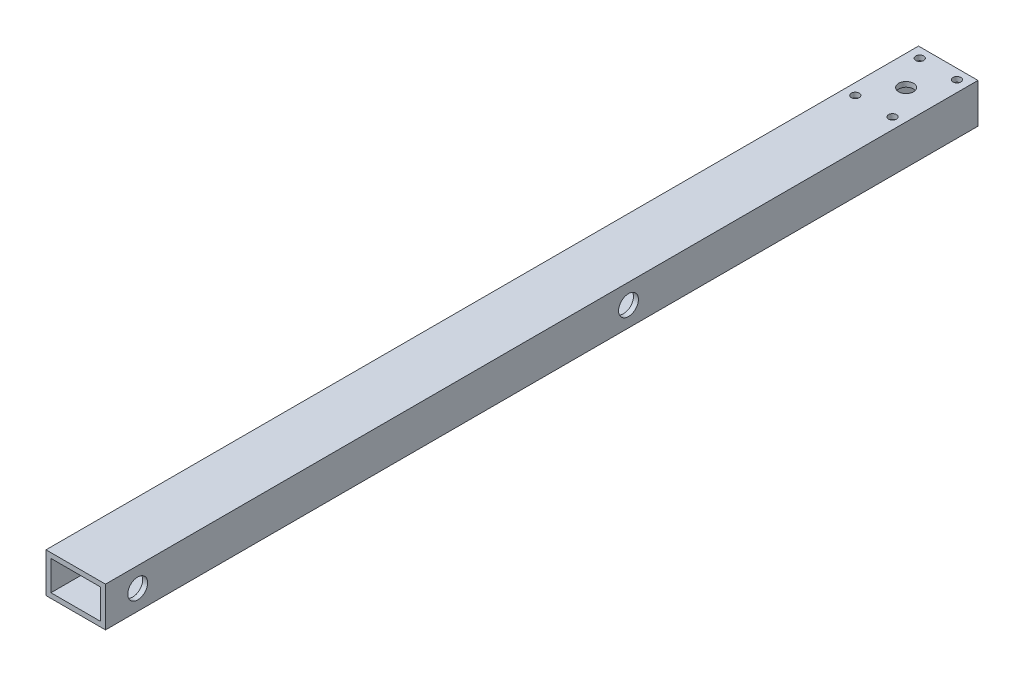
ISO-10303-21;
HEADER;
FILE_DESCRIPTION(('STEP AP214'),'2;1');
FILE_NAME('part.step','',(''),(''),'','','');
FILE_SCHEMA(('AUTOMOTIVE_DESIGN { 1 0 10303 214 1 1 1 1 }'));
ENDSEC;
DATA;
#1=APPLICATION_CONTEXT('core data for automotive mechanical design processes');
#2=APPLICATION_PROTOCOL_DEFINITION('international standard','automotive_design',2000,#1);
#3=PRODUCT_CONTEXT('',#1,'mechanical');
#4=PRODUCT('Part','Part','',(#3));
#5=PRODUCT_RELATED_PRODUCT_CATEGORY('part','',(#4));
#6=PRODUCT_DEFINITION_FORMATION('','',#4);
#7=PRODUCT_DEFINITION_CONTEXT('part definition',#1,'design');
#8=PRODUCT_DEFINITION('design','',#6,#7);
#9=PRODUCT_DEFINITION_SHAPE('','',#8);
#10=(LENGTH_UNIT() NAMED_UNIT(*) SI_UNIT(.MILLI.,.METRE.));
#11=(NAMED_UNIT(*) PLANE_ANGLE_UNIT() SI_UNIT($,.RADIAN.));
#12=(NAMED_UNIT(*) SI_UNIT($,.STERADIAN.) SOLID_ANGLE_UNIT());
#13=UNCERTAINTY_MEASURE_WITH_UNIT(LENGTH_MEASURE(1.E-05),#10,'distance_accuracy_value','');
#14=(GEOMETRIC_REPRESENTATION_CONTEXT(3) GLOBAL_UNCERTAINTY_ASSIGNED_CONTEXT((#13)) GLOBAL_UNIT_ASSIGNED_CONTEXT((#10,
#11,#12)) REPRESENTATION_CONTEXT('',''));
#15=CARTESIAN_POINT('',(0.,0.,0.));
#16=DIRECTION('',(0.,0.,1.));
#17=DIRECTION('',(1.,0.,0.));
#18=AXIS2_PLACEMENT_3D('',#15,#16,#17);
#19=CARTESIAN_POINT('',(0.,0.,558.8));
#20=DIRECTION('',(0.,0.,1.));
#21=DIRECTION('',(1.,0.,0.));
#22=AXIS2_PLACEMENT_3D('',#19,#20,#21);
#23=PLANE('',#22);
#24=DIRECTION('',(0.,1.,0.));
#25=VECTOR('',#24,1.);
#26=CARTESIAN_POINT('',(19.05,12.7,558.8));
#27=LINE('',#26,#25);
#28=CARTESIAN_POINT('',(19.05,-12.7,558.8));
#29=VERTEX_POINT('',#28);
#30=CARTESIAN_POINT('',(19.05,12.7,558.8));
#31=VERTEX_POINT('',#30);
#32=EDGE_CURVE('E141',#29,#31,#27,.T.);
#33=ORIENTED_EDGE('',*,*,#32,.T.);
#34=DIRECTION('',(-1.,0.,0.));
#35=VECTOR('',#34,1.);
#36=CARTESIAN_POINT('',(-19.05,12.7,558.8));
#37=LINE('',#36,#35);
#38=CARTESIAN_POINT('',(-19.05,12.7,558.8));
#39=VERTEX_POINT('',#38);
#40=EDGE_CURVE('E144',#31,#39,#37,.T.);
#41=ORIENTED_EDGE('',*,*,#40,.T.);
#42=DIRECTION('',(0.,-1.,0.));
#43=VECTOR('',#42,1.);
#44=CARTESIAN_POINT('',(-19.05,12.7,558.8));
#45=LINE('',#44,#43);
#46=CARTESIAN_POINT('',(-19.05,-12.7,558.8));
#47=VERTEX_POINT('',#46);
#48=EDGE_CURVE('E147',#39,#47,#45,.T.);
#49=ORIENTED_EDGE('',*,*,#48,.T.);
#50=DIRECTION('',(1.,0.,0.));
#51=VECTOR('',#50,1.);
#52=CARTESIAN_POINT('',(-19.05,-12.7,558.8));
#53=LINE('',#52,#51);
#54=EDGE_CURVE('E149',#47,#29,#53,.T.);
#55=ORIENTED_EDGE('',*,*,#54,.T.);
#56=EDGE_LOOP('',(#33,#41,#49,#55));
#57=FACE_BOUND('',#56,.T.);
#58=DIRECTION('',(-1.,0.,0.));
#59=VECTOR('',#58,1.);
#60=CARTESIAN_POINT('',(-15.875,9.525,558.8));
#61=LINE('',#60,#59);
#62=CARTESIAN_POINT('',(15.875,9.525,558.8));
#63=VERTEX_POINT('',#62);
#64=CARTESIAN_POINT('',(-15.875,9.525,558.8));
#65=VERTEX_POINT('',#64);
#66=EDGE_CURVE('E111',#63,#65,#61,.T.);
#67=ORIENTED_EDGE('',*,*,#66,.F.);
#68=DIRECTION('',(0.,1.,0.));
#69=VECTOR('',#68,1.);
#70=CARTESIAN_POINT('',(15.875,9.525,558.8));
#71=LINE('',#70,#69);
#72=CARTESIAN_POINT('',(15.875,-9.525,558.8));
#73=VERTEX_POINT('',#72);
#74=EDGE_CURVE('E103',#73,#63,#71,.T.);
#75=ORIENTED_EDGE('',*,*,#74,.F.);
#76=DIRECTION('',(1.,0.,0.));
#77=VECTOR('',#76,1.);
#78=CARTESIAN_POINT('',(-15.875,-9.525,558.8));
#79=LINE('',#78,#77);
#80=CARTESIAN_POINT('',(-15.875,-9.525,558.8));
#81=VERTEX_POINT('',#80);
#82=EDGE_CURVE('E125',#81,#73,#79,.T.);
#83=ORIENTED_EDGE('',*,*,#82,.F.);
#84=DIRECTION('',(0.,-1.,0.));
#85=VECTOR('',#84,1.);
#86=CARTESIAN_POINT('',(-15.875,9.525,558.8));
#87=LINE('',#86,#85);
#88=EDGE_CURVE('E123',#65,#81,#87,.T.);
#89=ORIENTED_EDGE('',*,*,#88,.F.);
#90=EDGE_LOOP('',(#67,#75,#83,#89));
#91=FACE_BOUND('',#90,.T.);
#92=ADVANCED_FACE('F36',(#57,#91),#23,.T.);
#93=CARTESIAN_POINT('',(0.,0.,0.));
#94=DIRECTION('',(0.,0.,1.));
#95=DIRECTION('',(1.,0.,0.));
#96=AXIS2_PLACEMENT_3D('',#93,#94,#95);
#97=PLANE('',#96);
#98=DIRECTION('',(0.,1.,0.));
#99=VECTOR('',#98,1.);
#100=CARTESIAN_POINT('',(19.05,12.7,0.));
#101=LINE('',#100,#99);
#102=CARTESIAN_POINT('',(19.05,-12.7,0.));
#103=VERTEX_POINT('',#102);
#104=CARTESIAN_POINT('',(19.05,12.7,0.));
#105=VERTEX_POINT('',#104);
#106=EDGE_CURVE('E119',#103,#105,#101,.T.);
#107=ORIENTED_EDGE('',*,*,#106,.F.);
#108=DIRECTION('',(1.,0.,0.));
#109=VECTOR('',#108,1.);
#110=CARTESIAN_POINT('',(-19.05,-12.7,0.));
#111=LINE('',#110,#109);
#112=CARTESIAN_POINT('',(-19.05,-12.7,0.));
#113=VERTEX_POINT('',#112);
#114=EDGE_CURVE('E145',#113,#103,#111,.T.);
#115=ORIENTED_EDGE('',*,*,#114,.F.);
#116=DIRECTION('',(0.,-1.,0.));
#117=VECTOR('',#116,1.);
#118=CARTESIAN_POINT('',(-19.05,12.7,0.));
#119=LINE('',#118,#117);
#120=CARTESIAN_POINT('',(-19.05,12.7,0.));
#121=VERTEX_POINT('',#120);
#122=EDGE_CURVE('E156',#121,#113,#119,.T.);
#123=ORIENTED_EDGE('',*,*,#122,.F.);
#124=DIRECTION('',(-1.,0.,0.));
#125=VECTOR('',#124,1.);
#126=CARTESIAN_POINT('',(-19.05,12.7,0.));
#127=LINE('',#126,#125);
#128=EDGE_CURVE('E154',#105,#121,#127,.T.);
#129=ORIENTED_EDGE('',*,*,#128,.F.);
#130=EDGE_LOOP('',(#107,#115,#123,#129));
#131=FACE_BOUND('',#130,.T.);
#132=DIRECTION('',(0.,1.,0.));
#133=VECTOR('',#132,1.);
#134=CARTESIAN_POINT('',(15.875,9.525,0.));
#135=LINE('',#134,#133);
#136=CARTESIAN_POINT('',(15.875,-9.525,0.));
#137=VERTEX_POINT('',#136);
#138=CARTESIAN_POINT('',(15.875,9.525,0.));
#139=VERTEX_POINT('',#138);
#140=EDGE_CURVE('E61',#137,#139,#135,.T.);
#141=ORIENTED_EDGE('',*,*,#140,.T.);
#142=DIRECTION('',(-1.,0.,0.));
#143=VECTOR('',#142,1.);
#144=CARTESIAN_POINT('',(-15.875,9.525,0.));
#145=LINE('',#144,#143);
#146=CARTESIAN_POINT('',(-15.875,9.525,0.));
#147=VERTEX_POINT('',#146);
#148=EDGE_CURVE('E118',#139,#147,#145,.T.);
#149=ORIENTED_EDGE('',*,*,#148,.T.);
#150=DIRECTION('',(0.,-1.,0.));
#151=VECTOR('',#150,1.);
#152=CARTESIAN_POINT('',(-15.875,9.525,0.));
#153=LINE('',#152,#151);
#154=CARTESIAN_POINT('',(-15.875,-9.525,0.));
#155=VERTEX_POINT('',#154);
#156=EDGE_CURVE('E133',#147,#155,#153,.T.);
#157=ORIENTED_EDGE('',*,*,#156,.T.);
#158=DIRECTION('',(1.,0.,0.));
#159=VECTOR('',#158,1.);
#160=CARTESIAN_POINT('',(-15.875,-9.525,0.));
#161=LINE('',#160,#159);
#162=EDGE_CURVE('E112',#155,#137,#161,.T.);
#163=ORIENTED_EDGE('',*,*,#162,.T.);
#164=EDGE_LOOP('',(#141,#149,#157,#163));
#165=FACE_BOUND('',#164,.T.);
#166=ADVANCED_FACE('F238',(#131,#165),#97,.F.);
#167=CARTESIAN_POINT('',(19.05,12.7,558.8));
#168=DIRECTION('',(-1.,0.,0.));
#169=DIRECTION('',(0.,0.,1.));
#170=AXIS2_PLACEMENT_3D('',#167,#168,#169);
#171=PLANE('',#170);
#172=CARTESIAN_POINT('',(19.05,0.,538.1625));
#173=DIRECTION('',(1.,0.,0.));
#174=DIRECTION('',(0.,0.,-1.));
#175=AXIS2_PLACEMENT_3D('',#172,#173,#174);
#176=CIRCLE('',#175,6.34999999999994);
#177=CARTESIAN_POINT('',(19.05,0.,531.8125));
#178=VERTEX_POINT('',#177);
#179=EDGE_CURVE('E338',#178,#178,#176,.T.);
#180=ORIENTED_EDGE('',*,*,#179,.F.);
#181=EDGE_LOOP('',(#180));
#182=FACE_BOUND('',#181,.T.);
#183=CARTESIAN_POINT('',(19.05,0.,223.8375));
#184=DIRECTION('',(1.,0.,0.));
#185=DIRECTION('',(0.,0.,-1.));
#186=AXIS2_PLACEMENT_3D('',#183,#184,#185);
#187=CIRCLE('',#186,6.35);
#188=CARTESIAN_POINT('',(19.05,0.,217.4875));
#189=VERTEX_POINT('',#188);
#190=EDGE_CURVE('E342',#189,#189,#187,.T.);
#191=ORIENTED_EDGE('',*,*,#190,.F.);
#192=EDGE_LOOP('',(#191));
#193=FACE_BOUND('',#192,.T.);
#194=ORIENTED_EDGE('',*,*,#106,.T.);
#195=DIRECTION('',(0.,0.,-1.));
#196=VECTOR('',#195,1.);
#197=CARTESIAN_POINT('',(19.05,12.7,558.8));
#198=LINE('',#197,#196);
#199=EDGE_CURVE('E11',#31,#105,#198,.T.);
#200=ORIENTED_EDGE('',*,*,#199,.F.);
#201=ORIENTED_EDGE('',*,*,#32,.F.);
#202=DIRECTION('',(0.,0.,-1.));
#203=VECTOR('',#202,1.);
#204=CARTESIAN_POINT('',(19.05,-12.7,558.8));
#205=LINE('',#204,#203);
#206=EDGE_CURVE('E151',#29,#103,#205,.T.);
#207=ORIENTED_EDGE('',*,*,#206,.T.);
#208=EDGE_LOOP('',(#194,#200,#201,#207));
#209=FACE_BOUND('',#208,.T.);
#210=ADVANCED_FACE('F38',(#182,#193,#209),#171,.F.);
#211=CARTESIAN_POINT('',(-19.05,12.7,558.8));
#212=DIRECTION('',(0.,-1.,0.));
#213=DIRECTION('',(0.,0.,-1.));
#214=AXIS2_PLACEMENT_3D('',#211,#212,#213);
#215=PLANE('',#214);
#216=CARTESIAN_POINT('',(11.9062500000003,12.7,6.36527007238319));
#217=DIRECTION('',(0.,1.,0.));
#218=DIRECTION('',(0.,0.,1.));
#219=AXIS2_PLACEMENT_3D('',#216,#217,#218);
#220=CIRCLE('',#219,2.54);
#221=CARTESIAN_POINT('',(11.9062500000003,12.7,8.90527007238318));
#222=VERTEX_POINT('',#221);
#223=EDGE_CURVE('E263',#222,#222,#220,.T.);
#224=ORIENTED_EDGE('',*,*,#223,.F.);
#225=EDGE_LOOP('',(#224));
#226=FACE_BOUND('',#225,.T.);
#227=CARTESIAN_POINT('',(-11.9062499999998,12.7,6.36527007238294));
#228=DIRECTION('',(0.,1.,0.));
#229=DIRECTION('',(0.,0.,1.));
#230=AXIS2_PLACEMENT_3D('',#227,#228,#229);
#231=CIRCLE('',#230,2.54);
#232=CARTESIAN_POINT('',(-11.9062499999998,12.7,8.90527007238294));
#233=VERTEX_POINT('',#232);
#234=EDGE_CURVE('E189',#233,#233,#231,.T.);
#235=ORIENTED_EDGE('',*,*,#234,.F.);
#236=EDGE_LOOP('',(#235));
#237=FACE_BOUND('',#236,.T.);
#238=CARTESIAN_POINT('',(-11.9062500000001,12.7,47.6097299276169));
#239=DIRECTION('',(0.,1.,0.));
#240=DIRECTION('',(0.,0.,1.));
#241=AXIS2_PLACEMENT_3D('',#238,#239,#240);
#242=CIRCLE('',#241,2.54);
#243=CARTESIAN_POINT('',(-11.9062500000001,12.7,50.1497299276169));
#244=VERTEX_POINT('',#243);
#245=EDGE_CURVE('E186',#244,#244,#242,.T.);
#246=ORIENTED_EDGE('',*,*,#245,.F.);
#247=EDGE_LOOP('',(#246));
#248=FACE_BOUND('',#247,.T.);
#249=CARTESIAN_POINT('',(11.90625,12.7,47.609729927617));
#250=DIRECTION('',(0.,1.,0.));
#251=DIRECTION('',(0.,0.,1.));
#252=AXIS2_PLACEMENT_3D('',#249,#250,#251);
#253=CIRCLE('',#252,2.54);
#254=CARTESIAN_POINT('',(11.90625,12.7,50.149729927617));
#255=VERTEX_POINT('',#254);
#256=EDGE_CURVE('E204',#255,#255,#253,.T.);
#257=ORIENTED_EDGE('',*,*,#256,.F.);
#258=EDGE_LOOP('',(#257));
#259=FACE_BOUND('',#258,.T.);
#260=CARTESIAN_POINT('',(0.,12.7,26.9875));
#261=DIRECTION('',(0.,1.,0.));
#262=DIRECTION('',(0.,0.,1.));
#263=AXIS2_PLACEMENT_3D('',#260,#261,#262);
#264=CIRCLE('',#263,4.7625);
#265=CARTESIAN_POINT('',(0.,12.7,31.75));
#266=VERTEX_POINT('',#265);
#267=EDGE_CURVE('E211',#266,#266,#264,.T.);
#268=ORIENTED_EDGE('',*,*,#267,.F.);
#269=EDGE_LOOP('',(#268));
#270=FACE_BOUND('',#269,.T.);
#271=ORIENTED_EDGE('',*,*,#128,.T.);
#272=DIRECTION('',(0.,0.,-1.));
#273=VECTOR('',#272,1.);
#274=CARTESIAN_POINT('',(-19.05,12.7,558.8));
#275=LINE('',#274,#273);
#276=EDGE_CURVE('E45',#39,#121,#275,.T.);
#277=ORIENTED_EDGE('',*,*,#276,.F.);
#278=ORIENTED_EDGE('',*,*,#40,.F.);
#279=ORIENTED_EDGE('',*,*,#199,.T.);
#280=EDGE_LOOP('',(#271,#277,#278,#279));
#281=FACE_BOUND('',#280,.T.);
#282=ADVANCED_FACE('F252',(#226,#237,#248,#259,#270,#281),#215,.F.);
#283=CARTESIAN_POINT('',(-19.05,12.7,558.8));
#284=DIRECTION('',(1.,0.,0.));
#285=DIRECTION('',(0.,0.,-1.));
#286=AXIS2_PLACEMENT_3D('',#283,#284,#285);
#287=PLANE('',#286);
#288=CARTESIAN_POINT('',(-19.05,0.,223.8375));
#289=DIRECTION('',(-1.,0.,0.));
#290=DIRECTION('',(0.,0.,1.));
#291=AXIS2_PLACEMENT_3D('',#288,#289,#290);
#292=CIRCLE('',#291,3.17499999999997);
#293=CARTESIAN_POINT('',(-19.05,0.,227.0125));
#294=VERTEX_POINT('',#293);
#295=EDGE_CURVE('E351',#294,#294,#292,.T.);
#296=ORIENTED_EDGE('',*,*,#295,.F.);
#297=EDGE_LOOP('',(#296));
#298=FACE_BOUND('',#297,.T.);
#299=CARTESIAN_POINT('',(-19.05,0.,538.1625));
#300=DIRECTION('',(-1.,0.,0.));
#301=DIRECTION('',(0.,0.,1.));
#302=AXIS2_PLACEMENT_3D('',#299,#300,#301);
#303=CIRCLE('',#302,3.17500000000008);
#304=CARTESIAN_POINT('',(-19.05,0.,541.3375));
#305=VERTEX_POINT('',#304);
#306=EDGE_CURVE('E357',#305,#305,#303,.T.);
#307=ORIENTED_EDGE('',*,*,#306,.F.);
#308=EDGE_LOOP('',(#307));
#309=FACE_BOUND('',#308,.T.);
#310=ORIENTED_EDGE('',*,*,#122,.T.);
#311=DIRECTION('',(0.,0.,-1.));
#312=VECTOR('',#311,1.);
#313=CARTESIAN_POINT('',(-19.05,-12.7,558.8));
#314=LINE('',#313,#312);
#315=EDGE_CURVE('E161',#47,#113,#314,.T.);
#316=ORIENTED_EDGE('',*,*,#315,.F.);
#317=ORIENTED_EDGE('',*,*,#48,.F.);
#318=ORIENTED_EDGE('',*,*,#276,.T.);
#319=EDGE_LOOP('',(#310,#316,#317,#318));
#320=FACE_BOUND('',#319,.T.);
#321=ADVANCED_FACE('F249',(#298,#309,#320),#287,.F.);
#322=CARTESIAN_POINT('',(-19.05,-12.7,558.8));
#323=DIRECTION('',(0.,1.,0.));
#324=DIRECTION('',(0.,0.,1.));
#325=AXIS2_PLACEMENT_3D('',#322,#323,#324);
#326=PLANE('',#325);
#327=CARTESIAN_POINT('',(11.9062500000003,-12.7,6.36527007238319));
#328=DIRECTION('',(0.,1.,0.));
#329=DIRECTION('',(0.,0.,1.));
#330=AXIS2_PLACEMENT_3D('',#327,#328,#329);
#331=CIRCLE('',#330,2.54);
#332=CARTESIAN_POINT('',(11.9062500000003,-12.7,8.90527007238318));
#333=VERTEX_POINT('',#332);
#334=EDGE_CURVE('E364',#333,#333,#331,.F.);
#335=ORIENTED_EDGE('',*,*,#334,.F.);
#336=EDGE_LOOP('',(#335));
#337=FACE_BOUND('',#336,.T.);
#338=CARTESIAN_POINT('',(-11.9062499999998,-12.7,6.36527007238294));
#339=DIRECTION('',(0.,1.,0.));
#340=DIRECTION('',(0.,0.,1.));
#341=AXIS2_PLACEMENT_3D('',#338,#339,#340);
#342=CIRCLE('',#341,2.54);
#343=CARTESIAN_POINT('',(-11.9062499999998,-12.7,8.90527007238294));
#344=VERTEX_POINT('',#343);
#345=EDGE_CURVE('E182',#344,#344,#342,.F.);
#346=ORIENTED_EDGE('',*,*,#345,.F.);
#347=EDGE_LOOP('',(#346));
#348=FACE_BOUND('',#347,.T.);
#349=CARTESIAN_POINT('',(-11.9062500000001,-12.7,47.6097299276169));
#350=DIRECTION('',(0.,1.,0.));
#351=DIRECTION('',(0.,0.,1.));
#352=AXIS2_PLACEMENT_3D('',#349,#350,#351);
#353=CIRCLE('',#352,2.54);
#354=CARTESIAN_POINT('',(-11.9062500000001,-12.7,50.1497299276169));
#355=VERTEX_POINT('',#354);
#356=EDGE_CURVE('E178',#355,#355,#353,.F.);
#357=ORIENTED_EDGE('',*,*,#356,.F.);
#358=EDGE_LOOP('',(#357));
#359=FACE_BOUND('',#358,.T.);
#360=CARTESIAN_POINT('',(11.90625,-12.7,47.609729927617));
#361=DIRECTION('',(0.,1.,0.));
#362=DIRECTION('',(0.,0.,1.));
#363=AXIS2_PLACEMENT_3D('',#360,#361,#362);
#364=CIRCLE('',#363,2.54);
#365=CARTESIAN_POINT('',(11.90625,-12.7,50.149729927617));
#366=VERTEX_POINT('',#365);
#367=EDGE_CURVE('E174',#366,#366,#364,.F.);
#368=ORIENTED_EDGE('',*,*,#367,.F.);
#369=EDGE_LOOP('',(#368));
#370=FACE_BOUND('',#369,.T.);
#371=CARTESIAN_POINT('',(0.,-12.7,26.9875));
#372=DIRECTION('',(0.,1.,0.));
#373=DIRECTION('',(0.,0.,1.));
#374=AXIS2_PLACEMENT_3D('',#371,#372,#373);
#375=CIRCLE('',#374,4.7625);
#376=CARTESIAN_POINT('',(0.,-12.7,31.75));
#377=VERTEX_POINT('',#376);
#378=EDGE_CURVE('E169',#377,#377,#375,.F.);
#379=ORIENTED_EDGE('',*,*,#378,.F.);
#380=EDGE_LOOP('',(#379));
#381=FACE_BOUND('',#380,.T.);
#382=ORIENTED_EDGE('',*,*,#114,.T.);
#383=ORIENTED_EDGE('',*,*,#206,.F.);
#384=ORIENTED_EDGE('',*,*,#54,.F.);
#385=ORIENTED_EDGE('',*,*,#315,.T.);
#386=EDGE_LOOP('',(#382,#383,#384,#385));
#387=FACE_BOUND('',#386,.T.);
#388=ADVANCED_FACE('F232',(#337,#348,#359,#370,#381,#387),#326,.F.);
#389=CARTESIAN_POINT('',(15.875,9.525,558.8));
#390=DIRECTION('',(-1.,0.,0.));
#391=DIRECTION('',(0.,-1.,0.));
#392=AXIS2_PLACEMENT_3D('',#389,#390,#391);
#393=PLANE('',#392);
#394=CARTESIAN_POINT('',(15.875,0.,538.1625));
#395=DIRECTION('',(-1.,0.,0.));
#396=DIRECTION('',(0.,-1.,0.));
#397=AXIS2_PLACEMENT_3D('',#394,#395,#396);
#398=CIRCLE('',#397,6.34999999999994);
#399=CARTESIAN_POINT('',(15.875,-6.34999999999994,538.1625));
#400=VERTEX_POINT('',#399);
#401=EDGE_CURVE('E341',#400,#400,#398,.F.);
#402=ORIENTED_EDGE('',*,*,#401,.T.);
#403=EDGE_LOOP('',(#402));
#404=FACE_BOUND('',#403,.T.);
#405=CARTESIAN_POINT('',(15.875,0.,223.8375));
#406=DIRECTION('',(-1.,0.,0.));
#407=DIRECTION('',(0.,-1.,0.));
#408=AXIS2_PLACEMENT_3D('',#405,#406,#407);
#409=CIRCLE('',#408,6.35);
#410=CARTESIAN_POINT('',(15.875,-6.35,223.8375));
#411=VERTEX_POINT('',#410);
#412=EDGE_CURVE('E345',#411,#411,#409,.F.);
#413=ORIENTED_EDGE('',*,*,#412,.T.);
#414=EDGE_LOOP('',(#413));
#415=FACE_BOUND('',#414,.T.);
#416=ORIENTED_EDGE('',*,*,#140,.F.);
#417=DIRECTION('',(0.,0.,-1.));
#418=VECTOR('',#417,1.);
#419=CARTESIAN_POINT('',(15.875,-9.525,558.8));
#420=LINE('',#419,#418);
#421=EDGE_CURVE('E107',#73,#137,#420,.T.);
#422=ORIENTED_EDGE('',*,*,#421,.F.);
#423=ORIENTED_EDGE('',*,*,#74,.T.);
#424=DIRECTION('',(0.,0.,-1.));
#425=VECTOR('',#424,1.);
#426=CARTESIAN_POINT('',(15.875,9.525,558.8));
#427=LINE('',#426,#425);
#428=EDGE_CURVE('E106',#63,#139,#427,.T.);
#429=ORIENTED_EDGE('',*,*,#428,.T.);
#430=EDGE_LOOP('',(#416,#422,#423,#429));
#431=FACE_BOUND('',#430,.T.);
#432=ADVANCED_FACE('F105',(#404,#415,#431),#393,.T.);
#433=CARTESIAN_POINT('',(-15.875,9.525,558.8));
#434=DIRECTION('',(0.,-1.,0.));
#435=DIRECTION('',(0.,0.,-1.));
#436=AXIS2_PLACEMENT_3D('',#433,#434,#435);
#437=PLANE('',#436);
#438=CARTESIAN_POINT('',(11.9062500000003,9.525,6.36527007238319));
#439=DIRECTION('',(0.,-1.,0.));
#440=DIRECTION('',(0.,0.,-1.));
#441=AXIS2_PLACEMENT_3D('',#438,#439,#440);
#442=CIRCLE('',#441,2.54);
#443=CARTESIAN_POINT('',(11.9062500000003,9.525,3.82527007238319));
#444=VERTEX_POINT('',#443);
#445=EDGE_CURVE('E194',#444,#444,#442,.T.);
#446=ORIENTED_EDGE('',*,*,#445,.F.);
#447=EDGE_LOOP('',(#446));
#448=FACE_BOUND('',#447,.T.);
#449=CARTESIAN_POINT('',(-11.9062499999998,9.525,6.36527007238294));
#450=DIRECTION('',(0.,-1.,0.));
#451=DIRECTION('',(0.,0.,-1.));
#452=AXIS2_PLACEMENT_3D('',#449,#450,#451);
#453=CIRCLE('',#452,2.54);
#454=CARTESIAN_POINT('',(-11.9062499999998,9.525,3.82527007238294));
#455=VERTEX_POINT('',#454);
#456=EDGE_CURVE('E181',#455,#455,#453,.T.);
#457=ORIENTED_EDGE('',*,*,#456,.F.);
#458=EDGE_LOOP('',(#457));
#459=FACE_BOUND('',#458,.T.);
#460=CARTESIAN_POINT('',(-11.9062500000001,9.525,47.6097299276169));
#461=DIRECTION('',(0.,-1.,0.));
#462=DIRECTION('',(0.,0.,-1.));
#463=AXIS2_PLACEMENT_3D('',#460,#461,#462);
#464=CIRCLE('',#463,2.54);
#465=CARTESIAN_POINT('',(-11.9062500000001,9.525,45.0697299276169));
#466=VERTEX_POINT('',#465);
#467=EDGE_CURVE('E177',#466,#466,#464,.T.);
#468=ORIENTED_EDGE('',*,*,#467,.F.);
#469=EDGE_LOOP('',(#468));
#470=FACE_BOUND('',#469,.T.);
#471=CARTESIAN_POINT('',(11.90625,9.525,47.609729927617));
#472=DIRECTION('',(0.,-1.,0.));
#473=DIRECTION('',(0.,0.,-1.));
#474=AXIS2_PLACEMENT_3D('',#471,#472,#473);
#475=CIRCLE('',#474,2.54);
#476=CARTESIAN_POINT('',(11.90625,9.525,45.069729927617));
#477=VERTEX_POINT('',#476);
#478=EDGE_CURVE('E173',#477,#477,#475,.T.);
#479=ORIENTED_EDGE('',*,*,#478,.F.);
#480=EDGE_LOOP('',(#479));
#481=FACE_BOUND('',#480,.T.);
#482=CARTESIAN_POINT('',(0.,9.525,26.9875));
#483=DIRECTION('',(0.,-1.,0.));
#484=DIRECTION('',(0.,0.,-1.));
#485=AXIS2_PLACEMENT_3D('',#482,#483,#484);
#486=CIRCLE('',#485,4.7625);
#487=CARTESIAN_POINT('',(0.,9.525,22.225));
#488=VERTEX_POINT('',#487);
#489=EDGE_CURVE('E131',#488,#488,#486,.T.);
#490=ORIENTED_EDGE('',*,*,#489,.F.);
#491=EDGE_LOOP('',(#490));
#492=FACE_BOUND('',#491,.T.);
#493=ORIENTED_EDGE('',*,*,#148,.F.);
#494=ORIENTED_EDGE('',*,*,#428,.F.);
#495=ORIENTED_EDGE('',*,*,#66,.T.);
#496=DIRECTION('',(0.,0.,-1.));
#497=VECTOR('',#496,1.);
#498=CARTESIAN_POINT('',(-15.875,9.525,558.8));
#499=LINE('',#498,#497);
#500=EDGE_CURVE('E120',#65,#147,#499,.T.);
#501=ORIENTED_EDGE('',*,*,#500,.T.);
#502=EDGE_LOOP('',(#493,#494,#495,#501));
#503=FACE_BOUND('',#502,.T.);
#504=ADVANCED_FACE('F115',(#448,#459,#470,#481,#492,#503),#437,.T.);
#505=CARTESIAN_POINT('',(-15.875,9.525,558.8));
#506=DIRECTION('',(1.,0.,0.));
#507=DIRECTION('',(0.,1.,0.));
#508=AXIS2_PLACEMENT_3D('',#505,#506,#507);
#509=PLANE('',#508);
#510=CARTESIAN_POINT('',(-15.875,0.,223.8375));
#511=DIRECTION('',(1.,0.,0.));
#512=DIRECTION('',(0.,1.,0.));
#513=AXIS2_PLACEMENT_3D('',#510,#511,#512);
#514=CIRCLE('',#513,3.17499999999997);
#515=CARTESIAN_POINT('',(-15.875,3.17499999999997,223.8375));
#516=VERTEX_POINT('',#515);
#517=EDGE_CURVE('E354',#516,#516,#514,.F.);
#518=ORIENTED_EDGE('',*,*,#517,.T.);
#519=EDGE_LOOP('',(#518));
#520=FACE_BOUND('',#519,.T.);
#521=CARTESIAN_POINT('',(-15.875,0.,538.1625));
#522=DIRECTION('',(1.,0.,0.));
#523=DIRECTION('',(0.,1.,0.));
#524=AXIS2_PLACEMENT_3D('',#521,#522,#523);
#525=CIRCLE('',#524,3.17500000000008);
#526=CARTESIAN_POINT('',(-15.875,3.17500000000008,538.1625));
#527=VERTEX_POINT('',#526);
#528=EDGE_CURVE('E360',#527,#527,#525,.F.);
#529=ORIENTED_EDGE('',*,*,#528,.T.);
#530=EDGE_LOOP('',(#529));
#531=FACE_BOUND('',#530,.T.);
#532=ORIENTED_EDGE('',*,*,#156,.F.);
#533=ORIENTED_EDGE('',*,*,#500,.F.);
#534=ORIENTED_EDGE('',*,*,#88,.T.);
#535=DIRECTION('',(0.,0.,-1.));
#536=VECTOR('',#535,1.);
#537=CARTESIAN_POINT('',(-15.875,-9.525,558.8));
#538=LINE('',#537,#536);
#539=EDGE_CURVE('E53',#81,#155,#538,.T.);
#540=ORIENTED_EDGE('',*,*,#539,.T.);
#541=EDGE_LOOP('',(#532,#533,#534,#540));
#542=FACE_BOUND('',#541,.T.);
#543=ADVANCED_FACE('F222',(#520,#531,#542),#509,.T.);
#544=CARTESIAN_POINT('',(-15.875,-9.525,558.8));
#545=DIRECTION('',(0.,1.,0.));
#546=DIRECTION('',(0.,0.,1.));
#547=AXIS2_PLACEMENT_3D('',#544,#545,#546);
#548=PLANE('',#547);
#549=CARTESIAN_POINT('',(11.9062500000003,-9.525,6.36527007238319));
#550=DIRECTION('',(0.,1.,0.));
#551=DIRECTION('',(0.,0.,1.));
#552=AXIS2_PLACEMENT_3D('',#549,#550,#551);
#553=CIRCLE('',#552,2.54);
#554=CARTESIAN_POINT('',(11.9062500000003,-9.525,8.90527007238318));
#555=VERTEX_POINT('',#554);
#556=EDGE_CURVE('E40',#555,#555,#553,.T.);
#557=ORIENTED_EDGE('',*,*,#556,.F.);
#558=EDGE_LOOP('',(#557));
#559=FACE_BOUND('',#558,.T.);
#560=CARTESIAN_POINT('',(-11.9062499999998,-9.525,6.36527007238294));
#561=DIRECTION('',(0.,1.,0.));
#562=DIRECTION('',(0.,0.,1.));
#563=AXIS2_PLACEMENT_3D('',#560,#561,#562);
#564=CIRCLE('',#563,2.54);
#565=CARTESIAN_POINT('',(-11.9062499999998,-9.525,8.90527007238294));
#566=VERTEX_POINT('',#565);
#567=EDGE_CURVE('E179',#566,#566,#564,.T.);
#568=ORIENTED_EDGE('',*,*,#567,.F.);
#569=EDGE_LOOP('',(#568));
#570=FACE_BOUND('',#569,.T.);
#571=CARTESIAN_POINT('',(-11.9062500000001,-9.525,47.6097299276169));
#572=DIRECTION('',(0.,1.,0.));
#573=DIRECTION('',(0.,0.,1.));
#574=AXIS2_PLACEMENT_3D('',#571,#572,#573);
#575=CIRCLE('',#574,2.54);
#576=CARTESIAN_POINT('',(-11.9062500000001,-9.525,50.1497299276169));
#577=VERTEX_POINT('',#576);
#578=EDGE_CURVE('E175',#577,#577,#575,.T.);
#579=ORIENTED_EDGE('',*,*,#578,.F.);
#580=EDGE_LOOP('',(#579));
#581=FACE_BOUND('',#580,.T.);
#582=CARTESIAN_POINT('',(11.90625,-9.525,47.609729927617));
#583=DIRECTION('',(0.,1.,0.));
#584=DIRECTION('',(0.,0.,1.));
#585=AXIS2_PLACEMENT_3D('',#582,#583,#584);
#586=CIRCLE('',#585,2.54);
#587=CARTESIAN_POINT('',(11.90625,-9.525,50.149729927617));
#588=VERTEX_POINT('',#587);
#589=EDGE_CURVE('E170',#588,#588,#586,.T.);
#590=ORIENTED_EDGE('',*,*,#589,.F.);
#591=EDGE_LOOP('',(#590));
#592=FACE_BOUND('',#591,.T.);
#593=CARTESIAN_POINT('',(0.,-9.525,26.9875));
#594=DIRECTION('',(0.,1.,0.));
#595=DIRECTION('',(0.,0.,1.));
#596=AXIS2_PLACEMENT_3D('',#593,#594,#595);
#597=CIRCLE('',#596,4.7625);
#598=CARTESIAN_POINT('',(0.,-9.525,31.75));
#599=VERTEX_POINT('',#598);
#600=EDGE_CURVE('E166',#599,#599,#597,.T.);
#601=ORIENTED_EDGE('',*,*,#600,.F.);
#602=EDGE_LOOP('',(#601));
#603=FACE_BOUND('',#602,.T.);
#604=ORIENTED_EDGE('',*,*,#162,.F.);
#605=ORIENTED_EDGE('',*,*,#539,.F.);
#606=ORIENTED_EDGE('',*,*,#82,.T.);
#607=ORIENTED_EDGE('',*,*,#421,.T.);
#608=EDGE_LOOP('',(#604,#605,#606,#607));
#609=FACE_BOUND('',#608,.T.);
#610=ADVANCED_FACE('F229',(#559,#570,#581,#592,#603,#609),#548,.T.);
#611=CARTESIAN_POINT('',(0.,-26.1703841816037,26.9875));
#612=DIRECTION('',(0.,1.,0.));
#613=DIRECTION('',(0.,0.,1.));
#614=AXIS2_PLACEMENT_3D('',#611,#612,#613);
#615=CYLINDRICAL_SURFACE('',#614,4.7625);
#616=ORIENTED_EDGE('',*,*,#600,.T.);
#617=EDGE_LOOP('',(#616));
#618=FACE_BOUND('',#617,.T.);
#619=ORIENTED_EDGE('',*,*,#378,.T.);
#620=EDGE_LOOP('',(#619));
#621=FACE_BOUND('',#620,.T.);
#622=ADVANCED_FACE('F288',(#618,#621),#615,.F.);
#623=ORIENTED_EDGE('',*,*,#489,.T.);
#624=EDGE_LOOP('',(#623));
#625=FACE_BOUND('',#624,.T.);
#626=ORIENTED_EDGE('',*,*,#267,.T.);
#627=EDGE_LOOP('',(#626));
#628=FACE_BOUND('',#627,.T.);
#629=ADVANCED_FACE('F218',(#625,#628),#615,.F.);
#630=CARTESIAN_POINT('',(11.90625,-26.1703841816037,47.609729927617));
#631=DIRECTION('',(0.,1.,0.));
#632=DIRECTION('',(0.,0.,1.));
#633=AXIS2_PLACEMENT_3D('',#630,#631,#632);
#634=CYLINDRICAL_SURFACE('',#633,2.54);
#635=ORIENTED_EDGE('',*,*,#589,.T.);
#636=EDGE_LOOP('',(#635));
#637=FACE_BOUND('',#636,.T.);
#638=ORIENTED_EDGE('',*,*,#367,.T.);
#639=EDGE_LOOP('',(#638));
#640=FACE_BOUND('',#639,.T.);
#641=ADVANCED_FACE('F299',(#637,#640),#634,.F.);
#642=ORIENTED_EDGE('',*,*,#478,.T.);
#643=EDGE_LOOP('',(#642));
#644=FACE_BOUND('',#643,.T.);
#645=ORIENTED_EDGE('',*,*,#256,.T.);
#646=EDGE_LOOP('',(#645));
#647=FACE_BOUND('',#646,.T.);
#648=ADVANCED_FACE('F302',(#644,#647),#634,.F.);
#649=CARTESIAN_POINT('',(-11.9062500000001,-26.1703841816037,47.6097299276169));
#650=DIRECTION('',(0.,1.,0.));
#651=DIRECTION('',(0.,0.,1.));
#652=AXIS2_PLACEMENT_3D('',#649,#650,#651);
#653=CYLINDRICAL_SURFACE('',#652,2.54);
#654=ORIENTED_EDGE('',*,*,#578,.T.);
#655=EDGE_LOOP('',(#654));
#656=FACE_BOUND('',#655,.T.);
#657=ORIENTED_EDGE('',*,*,#356,.T.);
#658=EDGE_LOOP('',(#657));
#659=FACE_BOUND('',#658,.T.);
#660=ADVANCED_FACE('F304',(#656,#659),#653,.F.);
#661=ORIENTED_EDGE('',*,*,#467,.T.);
#662=EDGE_LOOP('',(#661));
#663=FACE_BOUND('',#662,.T.);
#664=ORIENTED_EDGE('',*,*,#245,.T.);
#665=EDGE_LOOP('',(#664));
#666=FACE_BOUND('',#665,.T.);
#667=ADVANCED_FACE('F307',(#663,#666),#653,.F.);
#668=CARTESIAN_POINT('',(-11.9062499999998,-26.1703841816037,6.36527007238294));
#669=DIRECTION('',(0.,1.,0.));
#670=DIRECTION('',(0.,0.,1.));
#671=AXIS2_PLACEMENT_3D('',#668,#669,#670);
#672=CYLINDRICAL_SURFACE('',#671,2.54);
#673=ORIENTED_EDGE('',*,*,#567,.T.);
#674=EDGE_LOOP('',(#673));
#675=FACE_BOUND('',#674,.T.);
#676=ORIENTED_EDGE('',*,*,#345,.T.);
#677=EDGE_LOOP('',(#676));
#678=FACE_BOUND('',#677,.T.);
#679=ADVANCED_FACE('F309',(#675,#678),#672,.F.);
#680=ORIENTED_EDGE('',*,*,#456,.T.);
#681=EDGE_LOOP('',(#680));
#682=FACE_BOUND('',#681,.T.);
#683=ORIENTED_EDGE('',*,*,#234,.T.);
#684=EDGE_LOOP('',(#683));
#685=FACE_BOUND('',#684,.T.);
#686=ADVANCED_FACE('F312',(#682,#685),#672,.F.);
#687=CARTESIAN_POINT('',(11.9062500000003,-26.1703841816037,6.36527007238319));
#688=DIRECTION('',(0.,1.,0.));
#689=DIRECTION('',(0.,0.,1.));
#690=AXIS2_PLACEMENT_3D('',#687,#688,#689);
#691=CYLINDRICAL_SURFACE('',#690,2.54);
#692=ORIENTED_EDGE('',*,*,#556,.T.);
#693=EDGE_LOOP('',(#692));
#694=FACE_BOUND('',#693,.T.);
#695=ORIENTED_EDGE('',*,*,#334,.T.);
#696=EDGE_LOOP('',(#695));
#697=FACE_BOUND('',#696,.T.);
#698=ADVANCED_FACE('F313',(#694,#697),#691,.F.);
#699=ORIENTED_EDGE('',*,*,#445,.T.);
#700=EDGE_LOOP('',(#699));
#701=FACE_BOUND('',#700,.T.);
#702=ORIENTED_EDGE('',*,*,#223,.T.);
#703=EDGE_LOOP('',(#702));
#704=FACE_BOUND('',#703,.T.);
#705=ADVANCED_FACE('F316',(#701,#704),#691,.F.);
#706=CARTESIAN_POINT('',(-6.89474387893068,0.,538.1625));
#707=DIRECTION('',(-1.,0.,0.));
#708=DIRECTION('',(0.,0.,1.));
#709=AXIS2_PLACEMENT_3D('',#706,#707,#708);
#710=CYLINDRICAL_SURFACE('',#709,3.17500000000008);
#711=ORIENTED_EDGE('',*,*,#306,.T.);
#712=EDGE_LOOP('',(#711));
#713=FACE_BOUND('',#712,.T.);
#714=ORIENTED_EDGE('',*,*,#528,.F.);
#715=EDGE_LOOP('',(#714));
#716=FACE_BOUND('',#715,.T.);
#717=ADVANCED_FACE('F318',(#713,#716),#710,.F.);
#718=CARTESIAN_POINT('',(-6.89474387893068,0.,223.8375));
#719=DIRECTION('',(-1.,0.,0.));
#720=DIRECTION('',(0.,0.,1.));
#721=AXIS2_PLACEMENT_3D('',#718,#719,#720);
#722=CYLINDRICAL_SURFACE('',#721,3.17499999999997);
#723=ORIENTED_EDGE('',*,*,#295,.T.);
#724=EDGE_LOOP('',(#723));
#725=FACE_BOUND('',#724,.T.);
#726=ORIENTED_EDGE('',*,*,#517,.F.);
#727=EDGE_LOOP('',(#726));
#728=FACE_BOUND('',#727,.T.);
#729=ADVANCED_FACE('F321',(#725,#728),#722,.F.);
#730=CARTESIAN_POINT('',(-2.08551224213829,0.,223.8375));
#731=DIRECTION('',(1.,0.,0.));
#732=DIRECTION('',(0.,0.,-1.));
#733=AXIS2_PLACEMENT_3D('',#730,#731,#732);
#734=CYLINDRICAL_SURFACE('',#733,6.35);
#735=ORIENTED_EDGE('',*,*,#190,.T.);
#736=EDGE_LOOP('',(#735));
#737=FACE_BOUND('',#736,.T.);
#738=ORIENTED_EDGE('',*,*,#412,.F.);
#739=EDGE_LOOP('',(#738));
#740=FACE_BOUND('',#739,.T.);
#741=ADVANCED_FACE('F325',(#737,#740),#734,.F.);
#742=CARTESIAN_POINT('',(-2.08551224213829,0.,538.1625));
#743=DIRECTION('',(1.,0.,0.));
#744=DIRECTION('',(0.,0.,-1.));
#745=AXIS2_PLACEMENT_3D('',#742,#743,#744);
#746=CYLINDRICAL_SURFACE('',#745,6.34999999999994);
#747=ORIENTED_EDGE('',*,*,#179,.T.);
#748=EDGE_LOOP('',(#747));
#749=FACE_BOUND('',#748,.T.);
#750=ORIENTED_EDGE('',*,*,#401,.F.);
#751=EDGE_LOOP('',(#750));
#752=FACE_BOUND('',#751,.T.);
#753=ADVANCED_FACE('F329',(#749,#752),#746,.F.);
#754=CLOSED_SHELL('',(#92,#166,#210,#282,#321,#388,#432,#504,#543,#610,#622,#629,#641,#648,#660,
#667,#679,#686,#698,#705,#717,#729,#741,#753));
#755=MANIFOLD_SOLID_BREP('B2',#754);
#756=ADVANCED_BREP_SHAPE_REPRESENTATION('',(#18,#755),#14);
#757=SHAPE_DEFINITION_REPRESENTATION(#9,#756);
ENDSEC;
END-ISO-10303-21;
